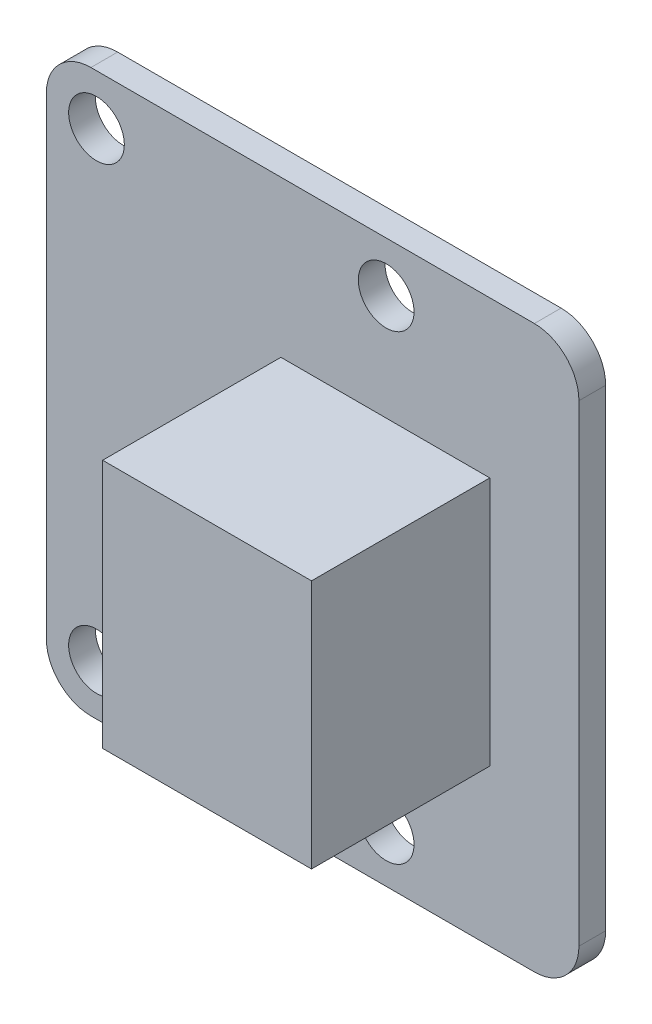
ISO-10303-21;
HEADER;
FILE_DESCRIPTION(('STEP AP214'),'2;1');
FILE_NAME('part.step','',(''),(''),'','','');
FILE_SCHEMA(('AUTOMOTIVE_DESIGN { 1 0 10303 214 1 1 1 1 }'));
ENDSEC;
DATA;
#1=APPLICATION_CONTEXT('core data for automotive mechanical design processes');
#2=APPLICATION_PROTOCOL_DEFINITION('international standard','automotive_design',2000,#1);
#3=PRODUCT_CONTEXT('',#1,'mechanical');
#4=PRODUCT('Part','Part','',(#3));
#5=PRODUCT_RELATED_PRODUCT_CATEGORY('part','',(#4));
#6=PRODUCT_DEFINITION_FORMATION('','',#4);
#7=PRODUCT_DEFINITION_CONTEXT('part definition',#1,'design');
#8=PRODUCT_DEFINITION('design','',#6,#7);
#9=PRODUCT_DEFINITION_SHAPE('','',#8);
#10=(LENGTH_UNIT() NAMED_UNIT(*) SI_UNIT(.MILLI.,.METRE.));
#11=(NAMED_UNIT(*) PLANE_ANGLE_UNIT() SI_UNIT($,.RADIAN.));
#12=(NAMED_UNIT(*) SI_UNIT($,.STERADIAN.) SOLID_ANGLE_UNIT());
#13=UNCERTAINTY_MEASURE_WITH_UNIT(LENGTH_MEASURE(1.E-05),#10,'distance_accuracy_value','');
#14=(GEOMETRIC_REPRESENTATION_CONTEXT(3) GLOBAL_UNCERTAINTY_ASSIGNED_CONTEXT((#13)) GLOBAL_UNIT_ASSIGNED_CONTEXT((#10,
#11,#12)) REPRESENTATION_CONTEXT('',''));
#15=CARTESIAN_POINT('',(0.,0.,0.));
#16=DIRECTION('',(0.,0.,1.));
#17=DIRECTION('',(1.,0.,0.));
#18=AXIS2_PLACEMENT_3D('',#15,#16,#17);
#19=CARTESIAN_POINT('',(0.,0.,1.2));
#20=DIRECTION('',(0.,0.,-1.));
#21=DIRECTION('',(-1.,0.,0.));
#22=AXIS2_PLACEMENT_3D('',#19,#20,#21);
#23=PLANE('',#22);
#24=DIRECTION('',(1.,0.,0.));
#25=VECTOR('',#24,1.);
#26=CARTESIAN_POINT('',(11.95,-12.6,1.2));
#27=LINE('',#26,#25);
#28=CARTESIAN_POINT('',(-9.94999999999999,-12.6,1.2));
#29=VERTEX_POINT('',#28);
#30=CARTESIAN_POINT('',(9.95,-12.6,1.2));
#31=VERTEX_POINT('',#30);
#32=EDGE_CURVE('E183',#29,#31,#27,.T.);
#33=ORIENTED_EDGE('',*,*,#32,.T.);
#34=CARTESIAN_POINT('',(9.95,-10.6,1.2));
#35=DIRECTION('',(0.,0.,-1.));
#36=DIRECTION('',(-1.,0.,0.));
#37=AXIS2_PLACEMENT_3D('',#34,#35,#36);
#38=CIRCLE('',#37,2.);
#39=CARTESIAN_POINT('',(11.95,-10.6,1.2));
#40=VERTEX_POINT('',#39);
#41=EDGE_CURVE('E223',#31,#40,#38,.F.);
#42=ORIENTED_EDGE('',*,*,#41,.T.);
#43=DIRECTION('',(0.,1.,0.));
#44=VECTOR('',#43,1.);
#45=CARTESIAN_POINT('',(11.95,-12.6,1.2));
#46=LINE('',#45,#44);
#47=CARTESIAN_POINT('',(11.95,10.6,1.2));
#48=VERTEX_POINT('',#47);
#49=EDGE_CURVE('E189',#40,#48,#46,.T.);
#50=ORIENTED_EDGE('',*,*,#49,.T.);
#51=CARTESIAN_POINT('',(9.95,10.6,1.2));
#52=DIRECTION('',(0.,0.,-1.));
#53=DIRECTION('',(-1.,0.,0.));
#54=AXIS2_PLACEMENT_3D('',#51,#52,#53);
#55=CIRCLE('',#54,2.);
#56=CARTESIAN_POINT('',(9.95,12.6,1.2));
#57=VERTEX_POINT('',#56);
#58=EDGE_CURVE('E224',#48,#57,#55,.F.);
#59=ORIENTED_EDGE('',*,*,#58,.T.);
#60=DIRECTION('',(-1.,0.,0.));
#61=VECTOR('',#60,1.);
#62=CARTESIAN_POINT('',(11.95,12.6,1.2));
#63=LINE('',#62,#61);
#64=CARTESIAN_POINT('',(-9.94999999999999,12.6,1.2));
#65=VERTEX_POINT('',#64);
#66=EDGE_CURVE('E178',#57,#65,#63,.T.);
#67=ORIENTED_EDGE('',*,*,#66,.T.);
#68=CARTESIAN_POINT('',(-9.95,10.6,1.2));
#69=DIRECTION('',(0.,0.,-1.));
#70=DIRECTION('',(-1.,0.,0.));
#71=AXIS2_PLACEMENT_3D('',#68,#69,#70);
#72=CIRCLE('',#71,2.);
#73=CARTESIAN_POINT('',(-11.95,10.6,1.2));
#74=VERTEX_POINT('',#73);
#75=EDGE_CURVE('E222',#65,#74,#72,.F.);
#76=ORIENTED_EDGE('',*,*,#75,.T.);
#77=DIRECTION('',(0.,-1.,0.));
#78=VECTOR('',#77,1.);
#79=CARTESIAN_POINT('',(-11.95,-12.6,1.2));
#80=LINE('',#79,#78);
#81=CARTESIAN_POINT('',(-11.95,-10.6,1.2));
#82=VERTEX_POINT('',#81);
#83=EDGE_CURVE('E182',#74,#82,#80,.T.);
#84=ORIENTED_EDGE('',*,*,#83,.T.);
#85=CARTESIAN_POINT('',(-9.95,-10.6,1.2));
#86=DIRECTION('',(0.,0.,-1.));
#87=DIRECTION('',(-1.,0.,0.));
#88=AXIS2_PLACEMENT_3D('',#85,#86,#87);
#89=CIRCLE('',#88,2.);
#90=EDGE_CURVE('E218',#82,#29,#89,.F.);
#91=ORIENTED_EDGE('',*,*,#90,.T.);
#92=EDGE_LOOP('',(#33,#42,#50,#59,#67,#76,#84,#91));
#93=FACE_BOUND('',#92,.T.);
#94=CARTESIAN_POINT('',(-9.7,-10.35,1.2));
#95=DIRECTION('',(0.,0.,1.));
#96=DIRECTION('',(1.,0.,0.));
#97=AXIS2_PLACEMENT_3D('',#94,#95,#96);
#98=CIRCLE('',#97,1.25);
#99=CARTESIAN_POINT('',(-8.45,-10.35,1.2));
#100=VERTEX_POINT('',#99);
#101=EDGE_CURVE('E159',#100,#100,#98,.T.);
#102=ORIENTED_EDGE('',*,*,#101,.F.);
#103=EDGE_LOOP('',(#102));
#104=FACE_BOUND('',#103,.T.);
#105=CARTESIAN_POINT('',(3.3,-10.35,1.2));
#106=DIRECTION('',(0.,0.,1.));
#107=DIRECTION('',(1.,0.,0.));
#108=AXIS2_PLACEMENT_3D('',#105,#106,#107);
#109=CIRCLE('',#108,1.25);
#110=CARTESIAN_POINT('',(4.55,-10.35,1.2));
#111=VERTEX_POINT('',#110);
#112=EDGE_CURVE('E160',#111,#111,#109,.T.);
#113=ORIENTED_EDGE('',*,*,#112,.F.);
#114=EDGE_LOOP('',(#113));
#115=FACE_BOUND('',#114,.T.);
#116=CARTESIAN_POINT('',(3.3,10.35,1.2));
#117=DIRECTION('',(0.,0.,1.));
#118=DIRECTION('',(1.,0.,0.));
#119=AXIS2_PLACEMENT_3D('',#116,#117,#118);
#120=CIRCLE('',#119,1.25);
#121=CARTESIAN_POINT('',(4.55,10.35,1.2));
#122=VERTEX_POINT('',#121);
#123=EDGE_CURVE('E163',#122,#122,#120,.T.);
#124=ORIENTED_EDGE('',*,*,#123,.F.);
#125=EDGE_LOOP('',(#124));
#126=FACE_BOUND('',#125,.T.);
#127=CARTESIAN_POINT('',(-9.70000000000007,10.35,1.2));
#128=DIRECTION('',(0.,0.,1.));
#129=DIRECTION('',(1.,0.,0.));
#130=AXIS2_PLACEMENT_3D('',#127,#128,#129);
#131=CIRCLE('',#130,1.25);
#132=CARTESIAN_POINT('',(-8.45000000000007,10.35,1.2));
#133=VERTEX_POINT('',#132);
#134=EDGE_CURVE('E151',#133,#133,#131,.T.);
#135=ORIENTED_EDGE('',*,*,#134,.F.);
#136=EDGE_LOOP('',(#135));
#137=FACE_BOUND('',#136,.T.);
#138=DIRECTION('',(0.,-1.,0.));
#139=VECTOR('',#138,1.);
#140=CARTESIAN_POINT('',(-1.42393079006629,-5.6,1.2));
#141=LINE('',#140,#139);
#142=CARTESIAN_POINT('',(-1.42393079006629,5.6,1.2));
#143=VERTEX_POINT('',#142);
#144=CARTESIAN_POINT('',(-1.42393079006629,-5.6,1.2));
#145=VERTEX_POINT('',#144);
#146=EDGE_CURVE('E53',#143,#145,#141,.T.);
#147=ORIENTED_EDGE('',*,*,#146,.F.);
#148=DIRECTION('',(-1.,0.,0.));
#149=VECTOR('',#148,1.);
#150=CARTESIAN_POINT('',(7.95,5.6,1.2));
#151=LINE('',#150,#149);
#152=CARTESIAN_POINT('',(7.95,5.6,1.2));
#153=VERTEX_POINT('',#152);
#154=EDGE_CURVE('E59',#153,#143,#151,.T.);
#155=ORIENTED_EDGE('',*,*,#154,.F.);
#156=DIRECTION('',(0.,1.,0.));
#157=VECTOR('',#156,1.);
#158=CARTESIAN_POINT('',(7.95,-5.6,1.2));
#159=LINE('',#158,#157);
#160=CARTESIAN_POINT('',(7.95,-5.6,1.2));
#161=VERTEX_POINT('',#160);
#162=EDGE_CURVE('E448',#161,#153,#159,.T.);
#163=ORIENTED_EDGE('',*,*,#162,.F.);
#164=DIRECTION('',(1.,0.,0.));
#165=VECTOR('',#164,1.);
#166=CARTESIAN_POINT('',(7.95,-5.6,1.2));
#167=LINE('',#166,#165);
#168=EDGE_CURVE('E457',#145,#161,#167,.T.);
#169=ORIENTED_EDGE('',*,*,#168,.F.);
#170=EDGE_LOOP('',(#147,#155,#163,#169));
#171=FACE_BOUND('',#170,.T.);
#172=ADVANCED_FACE('F39',(#93,#104,#115,#126,#137,#171),#23,.F.);
#173=CARTESIAN_POINT('',(11.95,12.6,1.2));
#174=DIRECTION('',(0.,-1.,0.));
#175=DIRECTION('',(0.,0.,-1.));
#176=AXIS2_PLACEMENT_3D('',#173,#174,#175);
#177=PLANE('',#176);
#178=ORIENTED_EDGE('',*,*,#66,.F.);
#179=DIRECTION('',(0.,0.,-1.));
#180=VECTOR('',#179,1.);
#181=CARTESIAN_POINT('',(9.95,12.6,1.2));
#182=LINE('',#181,#180);
#183=CARTESIAN_POINT('',(9.95,12.6,0.));
#184=VERTEX_POINT('',#183);
#185=EDGE_CURVE('E226',#57,#184,#182,.T.);
#186=ORIENTED_EDGE('',*,*,#185,.T.);
#187=DIRECTION('',(-1.,0.,0.));
#188=VECTOR('',#187,1.);
#189=CARTESIAN_POINT('',(11.95,12.6,0.));
#190=LINE('',#189,#188);
#191=CARTESIAN_POINT('',(-9.94999999999999,12.6,0.));
#192=VERTEX_POINT('',#191);
#193=EDGE_CURVE('E173',#184,#192,#190,.T.);
#194=ORIENTED_EDGE('',*,*,#193,.T.);
#195=DIRECTION('',(0.,0.,-1.));
#196=VECTOR('',#195,1.);
#197=CARTESIAN_POINT('',(-9.95,12.6,1.2));
#198=LINE('',#197,#196);
#199=EDGE_CURVE('E230',#192,#65,#198,.F.);
#200=ORIENTED_EDGE('',*,*,#199,.T.);
#201=EDGE_LOOP('',(#178,#186,#194,#200));
#202=FACE_BOUND('',#201,.T.);
#203=ADVANCED_FACE('F266',(#202),#177,.F.);
#204=CARTESIAN_POINT('',(-11.95,-12.6,1.2));
#205=DIRECTION('',(1.,0.,0.));
#206=DIRECTION('',(0.,0.,-1.));
#207=AXIS2_PLACEMENT_3D('',#204,#205,#206);
#208=PLANE('',#207);
#209=ORIENTED_EDGE('',*,*,#83,.F.);
#210=DIRECTION('',(0.,0.,-1.));
#211=VECTOR('',#210,1.);
#212=CARTESIAN_POINT('',(-11.95,10.6,1.2));
#213=LINE('',#212,#211);
#214=CARTESIAN_POINT('',(-11.95,10.6,0.));
#215=VERTEX_POINT('',#214);
#216=EDGE_CURVE('E11',#74,#215,#213,.T.);
#217=ORIENTED_EDGE('',*,*,#216,.T.);
#218=DIRECTION('',(0.,-1.,0.));
#219=VECTOR('',#218,1.);
#220=CARTESIAN_POINT('',(-11.95,-12.6,0.));
#221=LINE('',#220,#219);
#222=CARTESIAN_POINT('',(-11.95,-10.6,0.));
#223=VERTEX_POINT('',#222);
#224=EDGE_CURVE('E194',#215,#223,#221,.T.);
#225=ORIENTED_EDGE('',*,*,#224,.T.);
#226=DIRECTION('',(0.,0.,-1.));
#227=VECTOR('',#226,1.);
#228=CARTESIAN_POINT('',(-11.95,-10.6,1.2));
#229=LINE('',#228,#227);
#230=EDGE_CURVE('E50',#223,#82,#229,.F.);
#231=ORIENTED_EDGE('',*,*,#230,.T.);
#232=EDGE_LOOP('',(#209,#217,#225,#231));
#233=FACE_BOUND('',#232,.T.);
#234=ADVANCED_FACE('F234',(#233),#208,.F.);
#235=CARTESIAN_POINT('',(11.95,-12.6,1.2));
#236=DIRECTION('',(0.,1.,0.));
#237=DIRECTION('',(0.,0.,1.));
#238=AXIS2_PLACEMENT_3D('',#235,#236,#237);
#239=PLANE('',#238);
#240=DIRECTION('',(1.,0.,0.));
#241=VECTOR('',#240,1.);
#242=CARTESIAN_POINT('',(11.95,-12.6,0.));
#243=LINE('',#242,#241);
#244=CARTESIAN_POINT('',(-9.94999999999999,-12.6,0.));
#245=VERTEX_POINT('',#244);
#246=CARTESIAN_POINT('',(9.95,-12.6,0.));
#247=VERTEX_POINT('',#246);
#248=EDGE_CURVE('E197',#245,#247,#243,.T.);
#249=ORIENTED_EDGE('',*,*,#248,.T.);
#250=DIRECTION('',(0.,0.,-1.));
#251=VECTOR('',#250,1.);
#252=CARTESIAN_POINT('',(9.95,-12.6,1.2));
#253=LINE('',#252,#251);
#254=EDGE_CURVE('E220',#247,#31,#253,.F.);
#255=ORIENTED_EDGE('',*,*,#254,.T.);
#256=ORIENTED_EDGE('',*,*,#32,.F.);
#257=DIRECTION('',(0.,0.,-1.));
#258=VECTOR('',#257,1.);
#259=CARTESIAN_POINT('',(-9.95,-12.6,1.2));
#260=LINE('',#259,#258);
#261=EDGE_CURVE('E212',#29,#245,#260,.T.);
#262=ORIENTED_EDGE('',*,*,#261,.T.);
#263=EDGE_LOOP('',(#249,#255,#256,#262));
#264=FACE_BOUND('',#263,.T.);
#265=ADVANCED_FACE('F247',(#264),#239,.F.);
#266=CARTESIAN_POINT('',(11.95,-12.6,1.2));
#267=DIRECTION('',(-1.,0.,0.));
#268=DIRECTION('',(0.,0.,1.));
#269=AXIS2_PLACEMENT_3D('',#266,#267,#268);
#270=PLANE('',#269);
#271=ORIENTED_EDGE('',*,*,#49,.F.);
#272=DIRECTION('',(0.,0.,-1.));
#273=VECTOR('',#272,1.);
#274=CARTESIAN_POINT('',(11.95,-10.6,1.2));
#275=LINE('',#274,#273);
#276=CARTESIAN_POINT('',(11.95,-10.6,0.));
#277=VERTEX_POINT('',#276);
#278=EDGE_CURVE('E201',#40,#277,#275,.T.);
#279=ORIENTED_EDGE('',*,*,#278,.T.);
#280=DIRECTION('',(0.,1.,0.));
#281=VECTOR('',#280,1.);
#282=CARTESIAN_POINT('',(11.95,-12.6,0.));
#283=LINE('',#282,#281);
#284=CARTESIAN_POINT('',(11.95,10.6,0.));
#285=VERTEX_POINT('',#284);
#286=EDGE_CURVE('E185',#277,#285,#283,.T.);
#287=ORIENTED_EDGE('',*,*,#286,.T.);
#288=DIRECTION('',(0.,0.,-1.));
#289=VECTOR('',#288,1.);
#290=CARTESIAN_POINT('',(11.95,10.6,1.2));
#291=LINE('',#290,#289);
#292=EDGE_CURVE('E192',#285,#48,#291,.F.);
#293=ORIENTED_EDGE('',*,*,#292,.T.);
#294=EDGE_LOOP('',(#271,#279,#287,#293));
#295=FACE_BOUND('',#294,.T.);
#296=ADVANCED_FACE('F260',(#295),#270,.F.);
#297=CARTESIAN_POINT('',(0.,0.,0.));
#298=DIRECTION('',(0.,0.,-1.));
#299=DIRECTION('',(-1.,0.,0.));
#300=AXIS2_PLACEMENT_3D('',#297,#298,#299);
#301=PLANE('',#300);
#302=CARTESIAN_POINT('',(-9.70000000000007,10.35,0.));
#303=DIRECTION('',(0.,0.,1.));
#304=DIRECTION('',(1.,0.,0.));
#305=AXIS2_PLACEMENT_3D('',#302,#303,#304);
#306=CIRCLE('',#305,1.25);
#307=CARTESIAN_POINT('',(-8.45000000000007,10.35,0.));
#308=VERTEX_POINT('',#307);
#309=EDGE_CURVE('E146',#308,#308,#306,.T.);
#310=ORIENTED_EDGE('',*,*,#309,.T.);
#311=EDGE_LOOP('',(#310));
#312=FACE_BOUND('',#311,.T.);
#313=CARTESIAN_POINT('',(3.3,10.35,0.));
#314=DIRECTION('',(0.,0.,1.));
#315=DIRECTION('',(1.,0.,0.));
#316=AXIS2_PLACEMENT_3D('',#313,#314,#315);
#317=CIRCLE('',#316,1.25);
#318=CARTESIAN_POINT('',(4.55,10.35,0.));
#319=VERTEX_POINT('',#318);
#320=EDGE_CURVE('E170',#319,#319,#317,.T.);
#321=ORIENTED_EDGE('',*,*,#320,.T.);
#322=EDGE_LOOP('',(#321));
#323=FACE_BOUND('',#322,.T.);
#324=CARTESIAN_POINT('',(3.3,-10.35,0.));
#325=DIRECTION('',(0.,0.,1.));
#326=DIRECTION('',(1.,0.,0.));
#327=AXIS2_PLACEMENT_3D('',#324,#325,#326);
#328=CIRCLE('',#327,1.25);
#329=CARTESIAN_POINT('',(4.55,-10.35,0.));
#330=VERTEX_POINT('',#329);
#331=EDGE_CURVE('E161',#330,#330,#328,.T.);
#332=ORIENTED_EDGE('',*,*,#331,.T.);
#333=EDGE_LOOP('',(#332));
#334=FACE_BOUND('',#333,.T.);
#335=CARTESIAN_POINT('',(-9.7,-10.35,0.));
#336=DIRECTION('',(0.,0.,1.));
#337=DIRECTION('',(1.,0.,0.));
#338=AXIS2_PLACEMENT_3D('',#335,#336,#337);
#339=CIRCLE('',#338,1.25);
#340=CARTESIAN_POINT('',(-8.45,-10.35,0.));
#341=VERTEX_POINT('',#340);
#342=EDGE_CURVE('E175',#341,#341,#339,.T.);
#343=ORIENTED_EDGE('',*,*,#342,.T.);
#344=EDGE_LOOP('',(#343));
#345=FACE_BOUND('',#344,.T.);
#346=ORIENTED_EDGE('',*,*,#286,.F.);
#347=CARTESIAN_POINT('',(9.95,-10.6,0.));
#348=DIRECTION('',(0.,0.,-1.));
#349=DIRECTION('',(-1.,0.,0.));
#350=AXIS2_PLACEMENT_3D('',#347,#348,#349);
#351=CIRCLE('',#350,2.);
#352=EDGE_CURVE('E215',#277,#247,#351,.T.);
#353=ORIENTED_EDGE('',*,*,#352,.T.);
#354=ORIENTED_EDGE('',*,*,#248,.F.);
#355=CARTESIAN_POINT('',(-9.95,-10.6,0.));
#356=DIRECTION('',(0.,0.,-1.));
#357=DIRECTION('',(-1.,0.,0.));
#358=AXIS2_PLACEMENT_3D('',#355,#356,#357);
#359=CIRCLE('',#358,2.);
#360=EDGE_CURVE('E206',#245,#223,#359,.T.);
#361=ORIENTED_EDGE('',*,*,#360,.T.);
#362=ORIENTED_EDGE('',*,*,#224,.F.);
#363=CARTESIAN_POINT('',(-9.95,10.6,0.));
#364=DIRECTION('',(0.,0.,-1.));
#365=DIRECTION('',(-1.,0.,0.));
#366=AXIS2_PLACEMENT_3D('',#363,#364,#365);
#367=CIRCLE('',#366,2.);
#368=EDGE_CURVE('E208',#215,#192,#367,.T.);
#369=ORIENTED_EDGE('',*,*,#368,.T.);
#370=ORIENTED_EDGE('',*,*,#193,.F.);
#371=CARTESIAN_POINT('',(9.95,10.6,0.));
#372=DIRECTION('',(0.,0.,-1.));
#373=DIRECTION('',(-1.,0.,0.));
#374=AXIS2_PLACEMENT_3D('',#371,#372,#373);
#375=CIRCLE('',#374,2.);
#376=EDGE_CURVE('E209',#184,#285,#375,.T.);
#377=ORIENTED_EDGE('',*,*,#376,.T.);
#378=EDGE_LOOP('',(#346,#353,#354,#361,#362,#369,#370,#377));
#379=FACE_BOUND('',#378,.T.);
#380=ADVANCED_FACE('F246',(#312,#323,#334,#345,#379),#301,.T.);
#381=CARTESIAN_POINT('',(-9.7,-10.35,0.));
#382=DIRECTION('',(0.,0.,1.));
#383=DIRECTION('',(1.,0.,0.));
#384=AXIS2_PLACEMENT_3D('',#381,#382,#383);
#385=CYLINDRICAL_SURFACE('',#384,1.25);
#386=ORIENTED_EDGE('',*,*,#342,.F.);
#387=EDGE_LOOP('',(#386));
#388=FACE_BOUND('',#387,.T.);
#389=ORIENTED_EDGE('',*,*,#101,.T.);
#390=EDGE_LOOP('',(#389));
#391=FACE_BOUND('',#390,.T.);
#392=ADVANCED_FACE('F283',(#388,#391),#385,.F.);
#393=CARTESIAN_POINT('',(3.3,-10.35,0.));
#394=DIRECTION('',(0.,0.,1.));
#395=DIRECTION('',(1.,0.,0.));
#396=AXIS2_PLACEMENT_3D('',#393,#394,#395);
#397=CYLINDRICAL_SURFACE('',#396,1.25);
#398=ORIENTED_EDGE('',*,*,#331,.F.);
#399=EDGE_LOOP('',(#398));
#400=FACE_BOUND('',#399,.T.);
#401=ORIENTED_EDGE('',*,*,#112,.T.);
#402=EDGE_LOOP('',(#401));
#403=FACE_BOUND('',#402,.T.);
#404=ADVANCED_FACE('F308',(#400,#403),#397,.F.);
#405=CARTESIAN_POINT('',(3.3,10.35,0.));
#406=DIRECTION('',(0.,0.,1.));
#407=DIRECTION('',(1.,0.,0.));
#408=AXIS2_PLACEMENT_3D('',#405,#406,#407);
#409=CYLINDRICAL_SURFACE('',#408,1.25);
#410=ORIENTED_EDGE('',*,*,#320,.F.);
#411=EDGE_LOOP('',(#410));
#412=FACE_BOUND('',#411,.T.);
#413=ORIENTED_EDGE('',*,*,#123,.T.);
#414=EDGE_LOOP('',(#413));
#415=FACE_BOUND('',#414,.T.);
#416=ADVANCED_FACE('F302',(#412,#415),#409,.F.);
#417=CARTESIAN_POINT('',(-9.70000000000007,10.35,0.));
#418=DIRECTION('',(0.,0.,1.));
#419=DIRECTION('',(1.,0.,0.));
#420=AXIS2_PLACEMENT_3D('',#417,#418,#419);
#421=CYLINDRICAL_SURFACE('',#420,1.25);
#422=ORIENTED_EDGE('',*,*,#309,.F.);
#423=EDGE_LOOP('',(#422));
#424=FACE_BOUND('',#423,.T.);
#425=ORIENTED_EDGE('',*,*,#134,.T.);
#426=EDGE_LOOP('',(#425));
#427=FACE_BOUND('',#426,.T.);
#428=ADVANCED_FACE('F300',(#424,#427),#421,.F.);
#429=CARTESIAN_POINT('',(9.95,-10.6,1.2));
#430=DIRECTION('',(0.,0.,-1.));
#431=DIRECTION('',(-1.,0.,0.));
#432=AXIS2_PLACEMENT_3D('',#429,#430,#431);
#433=CYLINDRICAL_SURFACE('',#432,2.);
#434=ORIENTED_EDGE('',*,*,#41,.F.);
#435=ORIENTED_EDGE('',*,*,#254,.F.);
#436=ORIENTED_EDGE('',*,*,#352,.F.);
#437=ORIENTED_EDGE('',*,*,#278,.F.);
#438=EDGE_LOOP('',(#434,#435,#436,#437));
#439=FACE_BOUND('',#438,.T.);
#440=ADVANCED_FACE('F255',(#439),#433,.T.);
#441=CARTESIAN_POINT('',(9.95,10.6,1.2));
#442=DIRECTION('',(0.,0.,-1.));
#443=DIRECTION('',(-1.,0.,0.));
#444=AXIS2_PLACEMENT_3D('',#441,#442,#443);
#445=CYLINDRICAL_SURFACE('',#444,2.);
#446=ORIENTED_EDGE('',*,*,#58,.F.);
#447=ORIENTED_EDGE('',*,*,#292,.F.);
#448=ORIENTED_EDGE('',*,*,#376,.F.);
#449=ORIENTED_EDGE('',*,*,#185,.F.);
#450=EDGE_LOOP('',(#446,#447,#448,#449));
#451=FACE_BOUND('',#450,.T.);
#452=ADVANCED_FACE('F263',(#451),#445,.T.);
#453=CARTESIAN_POINT('',(-9.95,10.6,1.2));
#454=DIRECTION('',(0.,0.,-1.));
#455=DIRECTION('',(-1.,0.,0.));
#456=AXIS2_PLACEMENT_3D('',#453,#454,#455);
#457=CYLINDRICAL_SURFACE('',#456,2.);
#458=ORIENTED_EDGE('',*,*,#75,.F.);
#459=ORIENTED_EDGE('',*,*,#199,.F.);
#460=ORIENTED_EDGE('',*,*,#368,.F.);
#461=ORIENTED_EDGE('',*,*,#216,.F.);
#462=EDGE_LOOP('',(#458,#459,#460,#461));
#463=FACE_BOUND('',#462,.T.);
#464=ADVANCED_FACE('F267',(#463),#457,.T.);
#465=CARTESIAN_POINT('',(-9.95,-10.6,1.2));
#466=DIRECTION('',(0.,0.,-1.));
#467=DIRECTION('',(-1.,0.,0.));
#468=AXIS2_PLACEMENT_3D('',#465,#466,#467);
#469=CYLINDRICAL_SURFACE('',#468,2.);
#470=ORIENTED_EDGE('',*,*,#90,.F.);
#471=ORIENTED_EDGE('',*,*,#230,.F.);
#472=ORIENTED_EDGE('',*,*,#360,.F.);
#473=ORIENTED_EDGE('',*,*,#261,.F.);
#474=EDGE_LOOP('',(#470,#471,#472,#473));
#475=FACE_BOUND('',#474,.T.);
#476=ADVANCED_FACE('F41',(#475),#469,.T.);
#477=CARTESIAN_POINT('',(-1.42393079006629,-5.6,9.2));
#478=DIRECTION('',(1.,0.,0.));
#479=DIRECTION('',(0.,0.,-1.));
#480=AXIS2_PLACEMENT_3D('',#477,#478,#479);
#481=PLANE('',#480);
#482=ORIENTED_EDGE('',*,*,#146,.T.);
#483=DIRECTION('',(0.,0.,-1.));
#484=VECTOR('',#483,1.);
#485=CARTESIAN_POINT('',(-1.42393079006629,-5.6,9.2));
#486=LINE('',#485,#484);
#487=CARTESIAN_POINT('',(-1.42393079006629,-5.6,9.2));
#488=VERTEX_POINT('',#487);
#489=EDGE_CURVE('E132',#488,#145,#486,.T.);
#490=ORIENTED_EDGE('',*,*,#489,.F.);
#491=DIRECTION('',(0.,-1.,0.));
#492=VECTOR('',#491,1.);
#493=CARTESIAN_POINT('',(-1.42393079006629,-5.6,9.2));
#494=LINE('',#493,#492);
#495=CARTESIAN_POINT('',(-1.42393079006629,5.6,9.2));
#496=VERTEX_POINT('',#495);
#497=EDGE_CURVE('E140',#496,#488,#494,.T.);
#498=ORIENTED_EDGE('',*,*,#497,.F.);
#499=DIRECTION('',(0.,0.,-1.));
#500=VECTOR('',#499,1.);
#501=CARTESIAN_POINT('',(-1.42393079006629,5.6,9.2));
#502=LINE('',#501,#500);
#503=EDGE_CURVE('E449',#496,#143,#502,.T.);
#504=ORIENTED_EDGE('',*,*,#503,.T.);
#505=EDGE_LOOP('',(#482,#490,#498,#504));
#506=FACE_BOUND('',#505,.T.);
#507=ADVANCED_FACE('F150',(#506),#481,.F.);
#508=CARTESIAN_POINT('',(7.95,-5.6,9.2));
#509=DIRECTION('',(0.,1.,0.));
#510=DIRECTION('',(-1.,0.,0.));
#511=AXIS2_PLACEMENT_3D('',#508,#509,#510);
#512=PLANE('',#511);
#513=ORIENTED_EDGE('',*,*,#168,.T.);
#514=DIRECTION('',(0.,0.,-1.));
#515=VECTOR('',#514,1.);
#516=CARTESIAN_POINT('',(7.95,-5.6,9.2));
#517=LINE('',#516,#515);
#518=CARTESIAN_POINT('',(7.95,-5.6,9.2));
#519=VERTEX_POINT('',#518);
#520=EDGE_CURVE('E134',#519,#161,#517,.T.);
#521=ORIENTED_EDGE('',*,*,#520,.F.);
#522=DIRECTION('',(1.,0.,0.));
#523=VECTOR('',#522,1.);
#524=CARTESIAN_POINT('',(7.95,-5.6,9.2));
#525=LINE('',#524,#523);
#526=EDGE_CURVE('E127',#488,#519,#525,.T.);
#527=ORIENTED_EDGE('',*,*,#526,.F.);
#528=ORIENTED_EDGE('',*,*,#489,.T.);
#529=EDGE_LOOP('',(#513,#521,#527,#528));
#530=FACE_BOUND('',#529,.T.);
#531=ADVANCED_FACE('F129',(#530),#512,.F.);
#532=CARTESIAN_POINT('',(7.95,-5.6,9.2));
#533=DIRECTION('',(-1.,0.,0.));
#534=DIRECTION('',(0.,0.,1.));
#535=AXIS2_PLACEMENT_3D('',#532,#533,#534);
#536=PLANE('',#535);
#537=ORIENTED_EDGE('',*,*,#162,.T.);
#538=DIRECTION('',(0.,0.,-1.));
#539=VECTOR('',#538,1.);
#540=CARTESIAN_POINT('',(7.95,5.6,9.2));
#541=LINE('',#540,#539);
#542=CARTESIAN_POINT('',(7.95,5.6,9.2));
#543=VERTEX_POINT('',#542);
#544=EDGE_CURVE('E153',#543,#153,#541,.T.);
#545=ORIENTED_EDGE('',*,*,#544,.F.);
#546=DIRECTION('',(0.,1.,0.));
#547=VECTOR('',#546,1.);
#548=CARTESIAN_POINT('',(7.95,-5.6,9.2));
#549=LINE('',#548,#547);
#550=EDGE_CURVE('E137',#519,#543,#549,.T.);
#551=ORIENTED_EDGE('',*,*,#550,.F.);
#552=ORIENTED_EDGE('',*,*,#520,.T.);
#553=EDGE_LOOP('',(#537,#545,#551,#552));
#554=FACE_BOUND('',#553,.T.);
#555=ADVANCED_FACE('F318',(#554),#536,.F.);
#556=CARTESIAN_POINT('',(7.95,5.6,9.2));
#557=DIRECTION('',(0.,-1.,0.));
#558=DIRECTION('',(1.,0.,0.));
#559=AXIS2_PLACEMENT_3D('',#556,#557,#558);
#560=PLANE('',#559);
#561=ORIENTED_EDGE('',*,*,#154,.T.);
#562=ORIENTED_EDGE('',*,*,#503,.F.);
#563=DIRECTION('',(-1.,0.,0.));
#564=VECTOR('',#563,1.);
#565=CARTESIAN_POINT('',(7.95,5.6,9.2));
#566=LINE('',#565,#564);
#567=EDGE_CURVE('E142',#543,#496,#566,.T.);
#568=ORIENTED_EDGE('',*,*,#567,.F.);
#569=ORIENTED_EDGE('',*,*,#544,.T.);
#570=EDGE_LOOP('',(#561,#562,#568,#569));
#571=FACE_BOUND('',#570,.T.);
#572=ADVANCED_FACE('F321',(#571),#560,.F.);
#573=CARTESIAN_POINT('',(0.,0.,9.2));
#574=DIRECTION('',(0.,0.,1.));
#575=DIRECTION('',(1.,0.,0.));
#576=AXIS2_PLACEMENT_3D('',#573,#574,#575);
#577=PLANE('',#576);
#578=ORIENTED_EDGE('',*,*,#497,.T.);
#579=ORIENTED_EDGE('',*,*,#526,.T.);
#580=ORIENTED_EDGE('',*,*,#550,.T.);
#581=ORIENTED_EDGE('',*,*,#567,.T.);
#582=EDGE_LOOP('',(#578,#579,#580,#581));
#583=FACE_BOUND('',#582,.T.);
#584=ADVANCED_FACE('F136',(#583),#577,.T.);
#585=CLOSED_SHELL('',(#172,#203,#234,#265,#296,#380,#392,#404,#416,#428,#440,#452,#464,#476,
#507,#531,#555,#572,#584));
#586=MANIFOLD_SOLID_BREP('B2',#585);
#587=ADVANCED_BREP_SHAPE_REPRESENTATION('',(#18,#586),#14);
#588=SHAPE_DEFINITION_REPRESENTATION(#9,#587);
ENDSEC;
END-ISO-10303-21;
